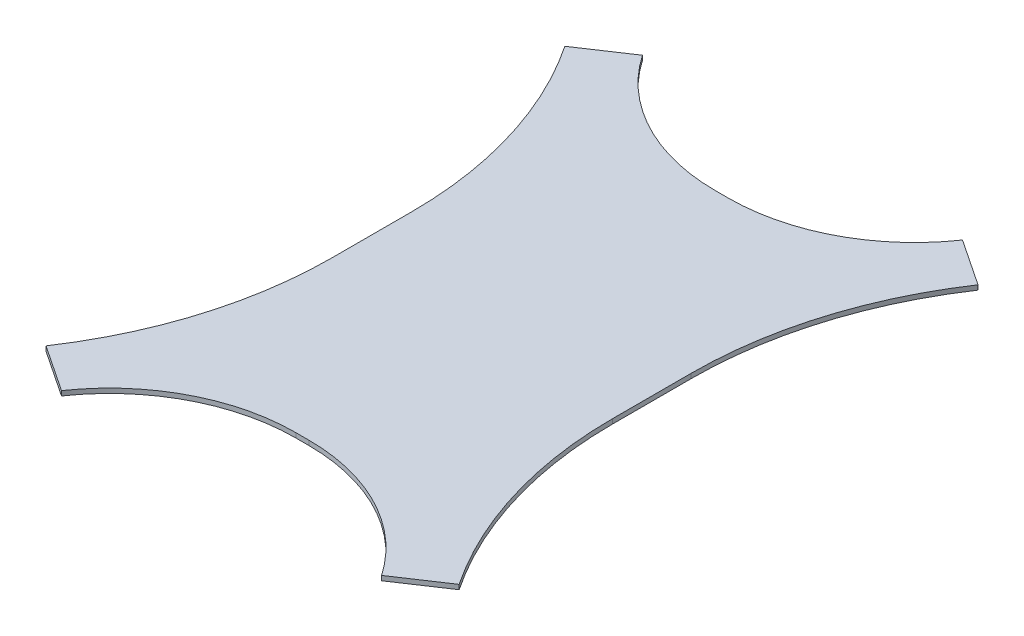
ISO-10303-21;
HEADER;
FILE_DESCRIPTION(('STEP AP214'),'2;1');
FILE_NAME('part.step','',(''),(''),'','','');
FILE_SCHEMA(('AUTOMOTIVE_DESIGN { 1 0 10303 214 1 1 1 1 }'));
ENDSEC;
DATA;
#1=APPLICATION_CONTEXT('core data for automotive mechanical design processes');
#2=APPLICATION_PROTOCOL_DEFINITION('international standard','automotive_design',2000,#1);
#3=PRODUCT_CONTEXT('',#1,'mechanical');
#4=PRODUCT('Part','Part','',(#3));
#5=PRODUCT_RELATED_PRODUCT_CATEGORY('part','',(#4));
#6=PRODUCT_DEFINITION_FORMATION('','',#4);
#7=PRODUCT_DEFINITION_CONTEXT('part definition',#1,'design');
#8=PRODUCT_DEFINITION('design','',#6,#7);
#9=PRODUCT_DEFINITION_SHAPE('','',#8);
#10=(LENGTH_UNIT() NAMED_UNIT(*) SI_UNIT(.MILLI.,.METRE.));
#11=(NAMED_UNIT(*) PLANE_ANGLE_UNIT() SI_UNIT($,.RADIAN.));
#12=(NAMED_UNIT(*) SI_UNIT($,.STERADIAN.) SOLID_ANGLE_UNIT());
#13=UNCERTAINTY_MEASURE_WITH_UNIT(LENGTH_MEASURE(1.E-05),#10,'distance_accuracy_value','');
#14=(GEOMETRIC_REPRESENTATION_CONTEXT(3) GLOBAL_UNCERTAINTY_ASSIGNED_CONTEXT((#13)) GLOBAL_UNIT_ASSIGNED_CONTEXT((#10,
#11,#12)) REPRESENTATION_CONTEXT('',''));
#15=CARTESIAN_POINT('',(0.,0.,0.));
#16=DIRECTION('',(0.,0.,1.));
#17=DIRECTION('',(1.,0.,0.));
#18=AXIS2_PLACEMENT_3D('',#15,#16,#17);
#19=CARTESIAN_POINT('',(60.,1.,-90.));
#20=DIRECTION('',(-1.,0.,0.));
#21=DIRECTION('',(0.,0.,1.));
#22=AXIS2_PLACEMENT_3D('',#19,#20,#21);
#23=PLANE('',#22);
#24=DIRECTION('',(0.,0.,-1.));
#25=VECTOR('',#24,1.);
#26=CARTESIAN_POINT('',(60.,-1.,-90.));
#27=LINE('',#26,#25);
#28=CARTESIAN_POINT('',(60.,-1.,16.894833932777));
#29=VERTEX_POINT('',#28);
#30=CARTESIAN_POINT('',(60.,-1.,-16.894833932777));
#31=VERTEX_POINT('',#30);
#32=EDGE_CURVE('E233',#29,#31,#27,.T.);
#33=ORIENTED_EDGE('',*,*,#32,.T.);
#34=DIRECTION('',(0.,-1.,0.));
#35=VECTOR('',#34,1.);
#36=CARTESIAN_POINT('',(60.,1.,-16.894833932777));
#37=LINE('',#36,#35);
#38=CARTESIAN_POINT('',(60.,1.,-16.894833932777));
#39=VERTEX_POINT('',#38);
#40=EDGE_CURVE('E311',#31,#39,#37,.F.);
#41=ORIENTED_EDGE('',*,*,#40,.T.);
#42=DIRECTION('',(0.,0.,-1.));
#43=VECTOR('',#42,1.);
#44=CARTESIAN_POINT('',(60.,1.,-90.));
#45=LINE('',#44,#43);
#46=CARTESIAN_POINT('',(60.,1.,16.894833932777));
#47=VERTEX_POINT('',#46);
#48=EDGE_CURVE('E238',#47,#39,#45,.T.);
#49=ORIENTED_EDGE('',*,*,#48,.F.);
#50=DIRECTION('',(0.,-1.,0.));
#51=VECTOR('',#50,1.);
#52=CARTESIAN_POINT('',(60.,-1.,16.8948339327771));
#53=LINE('',#52,#51);
#54=EDGE_CURVE('E308',#47,#29,#53,.T.);
#55=ORIENTED_EDGE('',*,*,#54,.T.);
#56=EDGE_LOOP('',(#33,#41,#49,#55));
#57=FACE_BOUND('',#56,.T.);
#58=ADVANCED_FACE('F33',(#57),#23,.F.);
#59=CARTESIAN_POINT('',(-60.,1.,90.));
#60=DIRECTION('',(0.,0.,-1.));
#61=DIRECTION('',(-1.,0.,0.));
#62=AXIS2_PLACEMENT_3D('',#59,#60,#61);
#63=PLANE('',#62);
#64=DIRECTION('',(1.,0.,0.));
#65=VECTOR('',#64,1.);
#66=CARTESIAN_POINT('',(-60.,1.,90.));
#67=LINE('',#66,#65);
#68=CARTESIAN_POINT('',(-2.77308622038017,1.,90.));
#69=VERTEX_POINT('',#68);
#70=CARTESIAN_POINT('',(2.77308622038017,1.,90.));
#71=VERTEX_POINT('',#70);
#72=EDGE_CURVE('E248',#69,#71,#67,.T.);
#73=ORIENTED_EDGE('',*,*,#72,.F.);
#74=DIRECTION('',(0.,-1.,0.));
#75=VECTOR('',#74,1.);
#76=CARTESIAN_POINT('',(-2.77308622038017,1.,90.));
#77=LINE('',#76,#75);
#78=CARTESIAN_POINT('',(-2.77308622038017,-1.,90.));
#79=VERTEX_POINT('',#78);
#80=EDGE_CURVE('E277',#69,#79,#77,.T.);
#81=ORIENTED_EDGE('',*,*,#80,.T.);
#82=DIRECTION('',(1.,0.,0.));
#83=VECTOR('',#82,1.);
#84=CARTESIAN_POINT('',(-60.,-1.,90.));
#85=LINE('',#84,#83);
#86=CARTESIAN_POINT('',(2.77308622038017,-1.,90.));
#87=VERTEX_POINT('',#86);
#88=EDGE_CURVE('E242',#79,#87,#85,.T.);
#89=ORIENTED_EDGE('',*,*,#88,.T.);
#90=DIRECTION('',(0.,-1.,0.));
#91=VECTOR('',#90,1.);
#92=CARTESIAN_POINT('',(2.77308622038017,1.,90.));
#93=LINE('',#92,#91);
#94=EDGE_CURVE('E274',#87,#71,#93,.F.);
#95=ORIENTED_EDGE('',*,*,#94,.T.);
#96=EDGE_LOOP('',(#73,#81,#89,#95));
#97=FACE_BOUND('',#96,.T.);
#98=ADVANCED_FACE('F343',(#97),#63,.F.);
#99=CARTESIAN_POINT('',(-60.,1.,-90.));
#100=DIRECTION('',(0.,0.,1.));
#101=DIRECTION('',(1.,0.,0.));
#102=AXIS2_PLACEMENT_3D('',#99,#100,#101);
#103=PLANE('',#102);
#104=DIRECTION('',(-1.,0.,0.));
#105=VECTOR('',#104,1.);
#106=CARTESIAN_POINT('',(-60.,1.,-90.));
#107=LINE('',#106,#105);
#108=CARTESIAN_POINT('',(2.77308622038024,1.,-90.));
#109=VERTEX_POINT('',#108);
#110=CARTESIAN_POINT('',(-2.77308622038024,1.,-90.));
#111=VERTEX_POINT('',#110);
#112=EDGE_CURVE('E241',#109,#111,#107,.T.);
#113=ORIENTED_EDGE('',*,*,#112,.F.);
#114=DIRECTION('',(0.,-1.,0.));
#115=VECTOR('',#114,1.);
#116=CARTESIAN_POINT('',(2.77308622038024,1.,-90.));
#117=LINE('',#116,#115);
#118=CARTESIAN_POINT('',(2.77308622038024,-1.,-90.));
#119=VERTEX_POINT('',#118);
#120=EDGE_CURVE('E264',#109,#119,#117,.T.);
#121=ORIENTED_EDGE('',*,*,#120,.T.);
#122=DIRECTION('',(-1.,0.,0.));
#123=VECTOR('',#122,1.);
#124=CARTESIAN_POINT('',(-60.,-1.,-90.));
#125=LINE('',#124,#123);
#126=CARTESIAN_POINT('',(-2.77308622038024,-1.,-90.));
#127=VERTEX_POINT('',#126);
#128=EDGE_CURVE('E254',#119,#127,#125,.T.);
#129=ORIENTED_EDGE('',*,*,#128,.T.);
#130=DIRECTION('',(0.,-1.,0.));
#131=VECTOR('',#130,1.);
#132=CARTESIAN_POINT('',(-2.77308622038024,1.,-90.));
#133=LINE('',#132,#131);
#134=EDGE_CURVE('E251',#127,#111,#133,.F.);
#135=ORIENTED_EDGE('',*,*,#134,.T.);
#136=EDGE_LOOP('',(#113,#121,#129,#135));
#137=FACE_BOUND('',#136,.T.);
#138=ADVANCED_FACE('F388',(#137),#103,.F.);
#139=CARTESIAN_POINT('',(-60.,1.,-90.));
#140=DIRECTION('',(1.,0.,0.));
#141=DIRECTION('',(0.,0.,-1.));
#142=AXIS2_PLACEMENT_3D('',#139,#140,#141);
#143=PLANE('',#142);
#144=DIRECTION('',(0.,0.,1.));
#145=VECTOR('',#144,1.);
#146=CARTESIAN_POINT('',(-60.,-1.,-90.));
#147=LINE('',#146,#145);
#148=CARTESIAN_POINT('',(-60.,-1.,-16.8948339327771));
#149=VERTEX_POINT('',#148);
#150=CARTESIAN_POINT('',(-60.,-1.,16.894833932777));
#151=VERTEX_POINT('',#150);
#152=EDGE_CURVE('E257',#149,#151,#147,.T.);
#153=ORIENTED_EDGE('',*,*,#152,.T.);
#154=DIRECTION('',(0.,-1.,0.));
#155=VECTOR('',#154,1.);
#156=CARTESIAN_POINT('',(-60.,1.,16.8948339327771));
#157=LINE('',#156,#155);
#158=CARTESIAN_POINT('',(-60.,1.,16.894833932777));
#159=VERTEX_POINT('',#158);
#160=EDGE_CURVE('E293',#151,#159,#157,.F.);
#161=ORIENTED_EDGE('',*,*,#160,.T.);
#162=DIRECTION('',(0.,0.,1.));
#163=VECTOR('',#162,1.);
#164=CARTESIAN_POINT('',(-60.,1.,-90.));
#165=LINE('',#164,#163);
#166=CARTESIAN_POINT('',(-60.,1.,-16.8948339327771));
#167=VERTEX_POINT('',#166);
#168=EDGE_CURVE('E245',#167,#159,#165,.T.);
#169=ORIENTED_EDGE('',*,*,#168,.F.);
#170=DIRECTION('',(0.,-1.,0.));
#171=VECTOR('',#170,1.);
#172=CARTESIAN_POINT('',(-60.,-1.,-16.8948339327771));
#173=LINE('',#172,#171);
#174=EDGE_CURVE('E290',#167,#149,#173,.T.);
#175=ORIENTED_EDGE('',*,*,#174,.T.);
#176=EDGE_LOOP('',(#153,#161,#169,#175));
#177=FACE_BOUND('',#176,.T.);
#178=ADVANCED_FACE('F362',(#177),#143,.F.);
#179=CARTESIAN_POINT('',(0.,1.,0.));
#180=DIRECTION('',(0.,1.,0.));
#181=DIRECTION('',(0.,0.,1.));
#182=AXIS2_PLACEMENT_3D('',#179,#180,#181);
#183=PLANE('',#182);
#184=DIRECTION('',(0.554700196225229,0.,0.832050294337844));
#185=VECTOR('',#184,1.);
#186=CARTESIAN_POINT('',(-68.6915549246456,1.,-124.670640039752));
#187=LINE('',#186,#185);
#188=CARTESIAN_POINT('',(88.5514499625666,1.,111.193867291066));
#189=VERTEX_POINT('',#188);
#190=CARTESIAN_POINT('',(88.6596525883614,1.,111.356171229758));
#191=VERTEX_POINT('',#190);
#192=EDGE_CURVE('E172',#189,#191,#187,.T.);
#193=ORIENTED_EDGE('',*,*,#192,.F.);
#194=CARTESIAN_POINT('',(230.,1.,16.894833932777));
#195=DIRECTION('',(0.,1.,0.));
#196=DIRECTION('',(0.,0.,1.));
#197=AXIS2_PLACEMENT_3D('',#194,#195,#196);
#198=CIRCLE('',#197,170.);
#199=EDGE_CURVE('E11',#189,#47,#198,.F.);
#200=ORIENTED_EDGE('',*,*,#199,.T.);
#201=ORIENTED_EDGE('',*,*,#48,.T.);
#202=CARTESIAN_POINT('',(230.,1.,-16.894833932777));
#203=DIRECTION('',(0.,1.,0.));
#204=DIRECTION('',(0.,0.,1.));
#205=AXIS2_PLACEMENT_3D('',#202,#203,#204);
#206=CIRCLE('',#205,170.);
#207=CARTESIAN_POINT('',(88.5514499625666,1.,-111.193867291066));
#208=VERTEX_POINT('',#207);
#209=EDGE_CURVE('E316',#39,#208,#206,.F.);
#210=ORIENTED_EDGE('',*,*,#209,.T.);
#211=DIRECTION('',(0.554700196225229,0.,-0.832050294337844));
#212=VECTOR('',#211,1.);
#213=CARTESIAN_POINT('',(-50.0165058683383,1.,96.6580664552914));
#214=LINE('',#213,#212);
#215=CARTESIAN_POINT('',(88.6596525883614,1.,-111.356171229758));
#216=VERTEX_POINT('',#215);
#217=EDGE_CURVE('E229',#208,#216,#214,.T.);
#218=ORIENTED_EDGE('',*,*,#217,.T.);
#219=DIRECTION('',(0.832050294337844,0.,0.554700196225229));
#220=VECTOR('',#219,1.);
#221=CARTESIAN_POINT('',(88.6596525883614,1.,-111.356171229758));
#222=LINE('',#221,#220);
#223=CARTESIAN_POINT('',(68.6904455242531,1.,-124.668975939164));
#224=VERTEX_POINT('',#223);
#225=EDGE_CURVE('E226',#224,#216,#222,.T.);
#226=ORIENTED_EDGE('',*,*,#225,.F.);
#227=CARTESIAN_POINT('',(2.77308622038024,1.,-170.));
#228=DIRECTION('',(0.,1.,0.));
#229=DIRECTION('',(0.,0.,1.));
#230=AXIS2_PLACEMENT_3D('',#227,#228,#229);
#231=CIRCLE('',#230,80.);
#232=EDGE_CURVE('E266',#224,#109,#231,.F.);
#233=ORIENTED_EDGE('',*,*,#232,.T.);
#234=ORIENTED_EDGE('',*,*,#112,.T.);
#235=CARTESIAN_POINT('',(-2.77308622038024,1.,-170.));
#236=DIRECTION('',(0.,1.,0.));
#237=DIRECTION('',(0.,0.,1.));
#238=AXIS2_PLACEMENT_3D('',#235,#236,#237);
#239=CIRCLE('',#238,80.);
#240=CARTESIAN_POINT('',(-68.6904455242531,1.,-124.668975939164));
#241=VERTEX_POINT('',#240);
#242=EDGE_CURVE('E270',#111,#241,#239,.F.);
#243=ORIENTED_EDGE('',*,*,#242,.T.);
#244=DIRECTION('',(-0.832050294337844,0.,0.554700196225229));
#245=VECTOR('',#244,1.);
#246=CARTESIAN_POINT('',(-88.6596525883614,1.,-111.356171229758));
#247=LINE('',#246,#245);
#248=CARTESIAN_POINT('',(-88.6596525883614,1.,-111.356171229758));
#249=VERTEX_POINT('',#248);
#250=EDGE_CURVE('E211',#241,#249,#247,.T.);
#251=ORIENTED_EDGE('',*,*,#250,.T.);
#252=DIRECTION('',(-0.554700196225229,0.,-0.832050294337844));
#253=VECTOR('',#252,1.);
#254=CARTESIAN_POINT('',(50.0165058683383,1.,96.6580664552914));
#255=LINE('',#254,#253);
#256=CARTESIAN_POINT('',(-88.5514499625666,1.,-111.193867291066));
#257=VERTEX_POINT('',#256);
#258=EDGE_CURVE('E203',#257,#249,#255,.T.);
#259=ORIENTED_EDGE('',*,*,#258,.F.);
#260=CARTESIAN_POINT('',(-230.,1.,-16.894833932777));
#261=DIRECTION('',(0.,1.,0.));
#262=DIRECTION('',(0.,0.,1.));
#263=AXIS2_PLACEMENT_3D('',#260,#261,#262);
#264=CIRCLE('',#263,170.);
#265=EDGE_CURVE('E303',#257,#167,#264,.F.);
#266=ORIENTED_EDGE('',*,*,#265,.T.);
#267=ORIENTED_EDGE('',*,*,#168,.T.);
#268=CARTESIAN_POINT('',(-230.,1.,16.8948339327771));
#269=DIRECTION('',(0.,1.,0.));
#270=DIRECTION('',(0.,0.,1.));
#271=AXIS2_PLACEMENT_3D('',#268,#269,#270);
#272=CIRCLE('',#271,170.);
#273=CARTESIAN_POINT('',(-88.5514499625666,1.,111.193867291066));
#274=VERTEX_POINT('',#273);
#275=EDGE_CURVE('E299',#159,#274,#272,.F.);
#276=ORIENTED_EDGE('',*,*,#275,.T.);
#277=DIRECTION('',(-0.554700196225229,0.,0.832050294337844));
#278=VECTOR('',#277,1.);
#279=CARTESIAN_POINT('',(68.6915549246456,1.,-124.670640039752));
#280=LINE('',#279,#278);
#281=CARTESIAN_POINT('',(-88.6596525883614,1.,111.356171229758));
#282=VERTEX_POINT('',#281);
#283=EDGE_CURVE('E187',#274,#282,#280,.T.);
#284=ORIENTED_EDGE('',*,*,#283,.T.);
#285=DIRECTION('',(-0.832050294337844,0.,-0.554700196225229));
#286=VECTOR('',#285,1.);
#287=CARTESIAN_POINT('',(-88.6596525883614,1.,111.356171229758));
#288=LINE('',#287,#286);
#289=CARTESIAN_POINT('',(-68.6904455242531,1.,124.668975939164));
#290=VERTEX_POINT('',#289);
#291=EDGE_CURVE('E197',#290,#282,#288,.T.);
#292=ORIENTED_EDGE('',*,*,#291,.F.);
#293=CARTESIAN_POINT('',(-2.77308622038017,1.,170.));
#294=DIRECTION('',(0.,1.,0.));
#295=DIRECTION('',(0.,0.,1.));
#296=AXIS2_PLACEMENT_3D('',#293,#294,#295);
#297=CIRCLE('',#296,80.);
#298=EDGE_CURVE('E279',#290,#69,#297,.F.);
#299=ORIENTED_EDGE('',*,*,#298,.T.);
#300=ORIENTED_EDGE('',*,*,#72,.T.);
#301=CARTESIAN_POINT('',(2.77308622038017,1.,170.));
#302=DIRECTION('',(0.,1.,0.));
#303=DIRECTION('',(0.,0.,1.));
#304=AXIS2_PLACEMENT_3D('',#301,#302,#303);
#305=CIRCLE('',#304,80.);
#306=CARTESIAN_POINT('',(68.6904455242531,1.,124.668975939164));
#307=VERTEX_POINT('',#306);
#308=EDGE_CURVE('E283',#71,#307,#305,.F.);
#309=ORIENTED_EDGE('',*,*,#308,.T.);
#310=DIRECTION('',(0.832050294337844,0.,-0.554700196225229));
#311=VECTOR('',#310,1.);
#312=CARTESIAN_POINT('',(88.6596525883614,1.,111.356171229758));
#313=LINE('',#312,#311);
#314=EDGE_CURVE('E171',#307,#191,#313,.T.);
#315=ORIENTED_EDGE('',*,*,#314,.T.);
#316=EDGE_LOOP('',(#193,#200,#201,#210,#218,#226,#233,#234,#243,#251,#259,#266,#267,#276,#284,
#292,#299,#300,#309,#315));
#317=FACE_BOUND('',#316,.T.);
#318=ADVANCED_FACE('F320',(#317),#183,.T.);
#319=CARTESIAN_POINT('',(0.,-1.,0.));
#320=DIRECTION('',(0.,1.,0.));
#321=DIRECTION('',(0.,0.,1.));
#322=AXIS2_PLACEMENT_3D('',#319,#320,#321);
#323=PLANE('',#322);
#324=ORIENTED_EDGE('',*,*,#32,.F.);
#325=CARTESIAN_POINT('',(230.,-1.,16.894833932777));
#326=DIRECTION('',(0.,1.,0.));
#327=DIRECTION('',(0.,0.,1.));
#328=AXIS2_PLACEMENT_3D('',#325,#326,#327);
#329=CIRCLE('',#328,170.);
#330=CARTESIAN_POINT('',(88.5514499625666,-1.,111.193867291066));
#331=VERTEX_POINT('',#330);
#332=EDGE_CURVE('E41',#29,#331,#329,.T.);
#333=ORIENTED_EDGE('',*,*,#332,.T.);
#334=DIRECTION('',(0.554700196225229,0.,0.832050294337844));
#335=VECTOR('',#334,1.);
#336=CARTESIAN_POINT('',(-68.6915549246456,-1.,-124.670640039752));
#337=LINE('',#336,#335);
#338=CARTESIAN_POINT('',(88.6596525883614,-1.,111.356171229758));
#339=VERTEX_POINT('',#338);
#340=EDGE_CURVE('E165',#331,#339,#337,.T.);
#341=ORIENTED_EDGE('',*,*,#340,.T.);
#342=DIRECTION('',(-0.832050294337844,0.,0.554700196225229));
#343=VECTOR('',#342,1.);
#344=CARTESIAN_POINT('',(88.6596525883614,-1.,111.356171229758));
#345=LINE('',#344,#343);
#346=CARTESIAN_POINT('',(68.6904455242531,-1.,124.668975939164));
#347=VERTEX_POINT('',#346);
#348=EDGE_CURVE('E168',#339,#347,#345,.T.);
#349=ORIENTED_EDGE('',*,*,#348,.T.);
#350=CARTESIAN_POINT('',(2.77308622038017,-1.,170.));
#351=DIRECTION('',(0.,1.,0.));
#352=DIRECTION('',(0.,0.,1.));
#353=AXIS2_PLACEMENT_3D('',#350,#351,#352);
#354=CIRCLE('',#353,80.);
#355=EDGE_CURVE('E285',#347,#87,#354,.T.);
#356=ORIENTED_EDGE('',*,*,#355,.T.);
#357=ORIENTED_EDGE('',*,*,#88,.F.);
#358=CARTESIAN_POINT('',(-2.77308622038017,-1.,170.));
#359=DIRECTION('',(0.,1.,0.));
#360=DIRECTION('',(0.,0.,1.));
#361=AXIS2_PLACEMENT_3D('',#358,#359,#360);
#362=CIRCLE('',#361,80.);
#363=CARTESIAN_POINT('',(-68.6904455242531,-1.,124.668975939164));
#364=VERTEX_POINT('',#363);
#365=EDGE_CURVE('E281',#79,#364,#362,.T.);
#366=ORIENTED_EDGE('',*,*,#365,.T.);
#367=DIRECTION('',(0.832050294337844,0.,0.554700196225229));
#368=VECTOR('',#367,1.);
#369=CARTESIAN_POINT('',(-88.6596525883614,-1.,111.356171229758));
#370=LINE('',#369,#368);
#371=CARTESIAN_POINT('',(-88.6596525883614,-1.,111.356171229758));
#372=VERTEX_POINT('',#371);
#373=EDGE_CURVE('E196',#372,#364,#370,.T.);
#374=ORIENTED_EDGE('',*,*,#373,.F.);
#375=DIRECTION('',(-0.554700196225229,0.,0.832050294337844));
#376=VECTOR('',#375,1.);
#377=CARTESIAN_POINT('',(68.6915549246456,-1.,-124.670640039752));
#378=LINE('',#377,#376);
#379=CARTESIAN_POINT('',(-88.5514499625666,-1.,111.193867291066));
#380=VERTEX_POINT('',#379);
#381=EDGE_CURVE('E185',#380,#372,#378,.T.);
#382=ORIENTED_EDGE('',*,*,#381,.F.);
#383=CARTESIAN_POINT('',(-230.,-1.,16.8948339327771));
#384=DIRECTION('',(0.,1.,0.));
#385=DIRECTION('',(0.,0.,1.));
#386=AXIS2_PLACEMENT_3D('',#383,#384,#385);
#387=CIRCLE('',#386,170.);
#388=EDGE_CURVE('E297',#380,#151,#387,.T.);
#389=ORIENTED_EDGE('',*,*,#388,.T.);
#390=ORIENTED_EDGE('',*,*,#152,.F.);
#391=CARTESIAN_POINT('',(-230.,-1.,-16.894833932777));
#392=DIRECTION('',(0.,1.,0.));
#393=DIRECTION('',(0.,0.,1.));
#394=AXIS2_PLACEMENT_3D('',#391,#392,#393);
#395=CIRCLE('',#394,170.);
#396=CARTESIAN_POINT('',(-88.5514499625666,-1.,-111.193867291066));
#397=VERTEX_POINT('',#396);
#398=EDGE_CURVE('E301',#149,#397,#395,.T.);
#399=ORIENTED_EDGE('',*,*,#398,.T.);
#400=DIRECTION('',(-0.554700196225229,0.,-0.832050294337844));
#401=VECTOR('',#400,1.);
#402=CARTESIAN_POINT('',(50.0165058683383,-1.,96.6580664552914));
#403=LINE('',#402,#401);
#404=CARTESIAN_POINT('',(-88.6596525883614,-1.,-111.356171229758));
#405=VERTEX_POINT('',#404);
#406=EDGE_CURVE('E214',#397,#405,#403,.T.);
#407=ORIENTED_EDGE('',*,*,#406,.T.);
#408=DIRECTION('',(0.832050294337844,0.,-0.554700196225229));
#409=VECTOR('',#408,1.);
#410=CARTESIAN_POINT('',(-88.6596525883614,-1.,-111.356171229758));
#411=LINE('',#410,#409);
#412=CARTESIAN_POINT('',(-68.6904455242531,-1.,-124.668975939164));
#413=VERTEX_POINT('',#412);
#414=EDGE_CURVE('E210',#405,#413,#411,.T.);
#415=ORIENTED_EDGE('',*,*,#414,.T.);
#416=CARTESIAN_POINT('',(-2.77308622038024,-1.,-170.));
#417=DIRECTION('',(0.,1.,0.));
#418=DIRECTION('',(0.,0.,1.));
#419=AXIS2_PLACEMENT_3D('',#416,#417,#418);
#420=CIRCLE('',#419,80.);
#421=EDGE_CURVE('E272',#413,#127,#420,.T.);
#422=ORIENTED_EDGE('',*,*,#421,.T.);
#423=ORIENTED_EDGE('',*,*,#128,.F.);
#424=CARTESIAN_POINT('',(2.77308622038024,-1.,-170.));
#425=DIRECTION('',(0.,1.,0.));
#426=DIRECTION('',(0.,0.,1.));
#427=AXIS2_PLACEMENT_3D('',#424,#425,#426);
#428=CIRCLE('',#427,80.);
#429=CARTESIAN_POINT('',(68.6904455242531,-1.,-124.668975939164));
#430=VERTEX_POINT('',#429);
#431=EDGE_CURVE('E268',#119,#430,#428,.T.);
#432=ORIENTED_EDGE('',*,*,#431,.T.);
#433=DIRECTION('',(-0.832050294337844,0.,-0.554700196225229));
#434=VECTOR('',#433,1.);
#435=CARTESIAN_POINT('',(88.6596525883614,-1.,-111.356171229758));
#436=LINE('',#435,#434);
#437=CARTESIAN_POINT('',(88.6596525883614,-1.,-111.356171229758));
#438=VERTEX_POINT('',#437);
#439=EDGE_CURVE('E225',#438,#430,#436,.T.);
#440=ORIENTED_EDGE('',*,*,#439,.F.);
#441=DIRECTION('',(0.554700196225229,0.,-0.832050294337844));
#442=VECTOR('',#441,1.);
#443=CARTESIAN_POINT('',(-50.0165058683383,-1.,96.6580664552914));
#444=LINE('',#443,#442);
#445=CARTESIAN_POINT('',(88.5514499625666,-1.,-111.193867291066));
#446=VERTEX_POINT('',#445);
#447=EDGE_CURVE('E218',#446,#438,#444,.T.);
#448=ORIENTED_EDGE('',*,*,#447,.F.);
#449=CARTESIAN_POINT('',(230.,-1.,-16.894833932777));
#450=DIRECTION('',(0.,1.,0.));
#451=DIRECTION('',(0.,0.,1.));
#452=AXIS2_PLACEMENT_3D('',#449,#450,#451);
#453=CIRCLE('',#452,170.);
#454=EDGE_CURVE('E314',#446,#31,#453,.T.);
#455=ORIENTED_EDGE('',*,*,#454,.T.);
#456=EDGE_LOOP('',(#324,#333,#341,#349,#356,#357,#366,#374,#382,#389,#390,#399,#407,#415,#422,
#423,#432,#440,#448,#455));
#457=FACE_BOUND('',#456,.T.);
#458=ADVANCED_FACE('F167',(#457),#323,.F.);
#459=CARTESIAN_POINT('',(78.6750490563072,0.,-118.012573584461));
#460=DIRECTION('',(0.554700196225229,0.,-0.832050294337844));
#461=DIRECTION('',(-0.832050294337844,0.,-0.554700196225229));
#462=AXIS2_PLACEMENT_3D('',#459,#460,#461);
#463=PLANE('',#462);
#464=DIRECTION('',(0.,-1.,0.));
#465=VECTOR('',#464,1.);
#466=CARTESIAN_POINT('',(88.6596525883614,1.,-111.356171229758));
#467=LINE('',#466,#465);
#468=EDGE_CURVE('E230',#216,#438,#467,.T.);
#469=ORIENTED_EDGE('',*,*,#468,.T.);
#470=ORIENTED_EDGE('',*,*,#439,.T.);
#471=DIRECTION('',(0.,1.,0.));
#472=VECTOR('',#471,1.);
#473=CARTESIAN_POINT('',(68.6904455242531,1.,-124.668975939164));
#474=LINE('',#473,#472);
#475=EDGE_CURVE('E222',#430,#224,#474,.T.);
#476=ORIENTED_EDGE('',*,*,#475,.T.);
#477=ORIENTED_EDGE('',*,*,#225,.T.);
#478=EDGE_LOOP('',(#469,#470,#476,#477));
#479=FACE_BOUND('',#478,.T.);
#480=ADVANCED_FACE('F395',(#479),#463,.T.);
#481=CARTESIAN_POINT('',(-50.0165058683383,1.,96.6580664552914));
#482=DIRECTION('',(0.832050294337844,0.,0.554700196225229));
#483=DIRECTION('',(0.554700196225229,0.,-0.832050294337844));
#484=AXIS2_PLACEMENT_3D('',#481,#482,#483);
#485=PLANE('',#484);
#486=ORIENTED_EDGE('',*,*,#217,.F.);
#487=DIRECTION('',(0.,-1.,0.));
#488=VECTOR('',#487,1.);
#489=CARTESIAN_POINT('',(88.5514499625666,1.,-111.193867291066));
#490=LINE('',#489,#488);
#491=EDGE_CURVE('E305',#208,#446,#490,.T.);
#492=ORIENTED_EDGE('',*,*,#491,.T.);
#493=ORIENTED_EDGE('',*,*,#447,.T.);
#494=ORIENTED_EDGE('',*,*,#468,.F.);
#495=EDGE_LOOP('',(#486,#492,#493,#494));
#496=FACE_BOUND('',#495,.T.);
#497=ADVANCED_FACE('F328',(#496),#485,.T.);
#498=CARTESIAN_POINT('',(-78.6750490563072,0.,-118.012573584461));
#499=DIRECTION('',(-0.554700196225229,0.,-0.832050294337844));
#500=DIRECTION('',(0.832050294337844,0.,-0.554700196225229));
#501=AXIS2_PLACEMENT_3D('',#498,#499,#500);
#502=PLANE('',#501);
#503=DIRECTION('',(0.,-1.,0.));
#504=VECTOR('',#503,1.);
#505=CARTESIAN_POINT('',(-88.6596525883614,1.,-111.356171229758));
#506=LINE('',#505,#504);
#507=EDGE_CURVE('E215',#249,#405,#506,.T.);
#508=ORIENTED_EDGE('',*,*,#507,.F.);
#509=ORIENTED_EDGE('',*,*,#250,.F.);
#510=DIRECTION('',(0.,1.,0.));
#511=VECTOR('',#510,1.);
#512=CARTESIAN_POINT('',(-68.6904455242531,1.,-124.668975939164));
#513=LINE('',#512,#511);
#514=EDGE_CURVE('E207',#413,#241,#513,.T.);
#515=ORIENTED_EDGE('',*,*,#514,.F.);
#516=ORIENTED_EDGE('',*,*,#414,.F.);
#517=EDGE_LOOP('',(#508,#509,#515,#516));
#518=FACE_BOUND('',#517,.T.);
#519=ADVANCED_FACE('F379',(#518),#502,.T.);
#520=CARTESIAN_POINT('',(50.0165058683383,1.,96.6580664552914));
#521=DIRECTION('',(0.832050294337844,0.,-0.554700196225229));
#522=DIRECTION('',(-0.554700196225229,0.,-0.832050294337844));
#523=AXIS2_PLACEMENT_3D('',#520,#521,#522);
#524=PLANE('',#523);
#525=ORIENTED_EDGE('',*,*,#406,.F.);
#526=DIRECTION('',(0.,-1.,0.));
#527=VECTOR('',#526,1.);
#528=CARTESIAN_POINT('',(-88.5514499625666,1.,-111.193867291066));
#529=LINE('',#528,#527);
#530=EDGE_CURVE('E295',#397,#257,#529,.F.);
#531=ORIENTED_EDGE('',*,*,#530,.T.);
#532=ORIENTED_EDGE('',*,*,#258,.T.);
#533=ORIENTED_EDGE('',*,*,#507,.T.);
#534=EDGE_LOOP('',(#525,#531,#532,#533));
#535=FACE_BOUND('',#534,.T.);
#536=ADVANCED_FACE('F375',(#535),#524,.F.);
#537=CARTESIAN_POINT('',(-78.6750490563072,0.,118.012573584461));
#538=DIRECTION('',(-0.554700196225229,0.,0.832050294337844));
#539=DIRECTION('',(0.832050294337844,0.,0.554700196225229));
#540=AXIS2_PLACEMENT_3D('',#537,#538,#539);
#541=PLANE('',#540);
#542=DIRECTION('',(0.,-1.,0.));
#543=VECTOR('',#542,1.);
#544=CARTESIAN_POINT('',(-88.6596525883614,1.,111.356171229758));
#545=LINE('',#544,#543);
#546=EDGE_CURVE('E200',#282,#372,#545,.T.);
#547=ORIENTED_EDGE('',*,*,#546,.T.);
#548=ORIENTED_EDGE('',*,*,#373,.T.);
#549=DIRECTION('',(0.,1.,0.));
#550=VECTOR('',#549,1.);
#551=CARTESIAN_POINT('',(-68.6904455242531,1.,124.668975939164));
#552=LINE('',#551,#550);
#553=EDGE_CURVE('E193',#364,#290,#552,.T.);
#554=ORIENTED_EDGE('',*,*,#553,.T.);
#555=ORIENTED_EDGE('',*,*,#291,.T.);
#556=EDGE_LOOP('',(#547,#548,#554,#555));
#557=FACE_BOUND('',#556,.T.);
#558=ADVANCED_FACE('F352',(#557),#541,.T.);
#559=CARTESIAN_POINT('',(68.6915549246456,1.,-124.670640039752));
#560=DIRECTION('',(-0.832050294337844,0.,-0.554700196225229));
#561=DIRECTION('',(-0.554700196225229,0.,0.832050294337844));
#562=AXIS2_PLACEMENT_3D('',#559,#560,#561);
#563=PLANE('',#562);
#564=ORIENTED_EDGE('',*,*,#283,.F.);
#565=DIRECTION('',(0.,-1.,0.));
#566=VECTOR('',#565,1.);
#567=CARTESIAN_POINT('',(-88.5514499625666,1.,111.193867291066));
#568=LINE('',#567,#566);
#569=EDGE_CURVE('E287',#274,#380,#568,.T.);
#570=ORIENTED_EDGE('',*,*,#569,.T.);
#571=ORIENTED_EDGE('',*,*,#381,.T.);
#572=ORIENTED_EDGE('',*,*,#546,.F.);
#573=EDGE_LOOP('',(#564,#570,#571,#572));
#574=FACE_BOUND('',#573,.T.);
#575=ADVANCED_FACE('F356',(#574),#563,.T.);
#576=CARTESIAN_POINT('',(78.6750490563072,0.,118.012573584461));
#577=DIRECTION('',(0.554700196225229,0.,0.832050294337844));
#578=DIRECTION('',(-0.832050294337844,0.,0.554700196225229));
#579=AXIS2_PLACEMENT_3D('',#576,#577,#578);
#580=PLANE('',#579);
#581=DIRECTION('',(0.,-1.,0.));
#582=VECTOR('',#581,1.);
#583=CARTESIAN_POINT('',(88.6596525883614,1.,111.356171229758));
#584=LINE('',#583,#582);
#585=EDGE_CURVE('E178',#191,#339,#584,.T.);
#586=ORIENTED_EDGE('',*,*,#585,.F.);
#587=ORIENTED_EDGE('',*,*,#314,.F.);
#588=DIRECTION('',(0.,1.,0.));
#589=VECTOR('',#588,1.);
#590=CARTESIAN_POINT('',(68.6904455242531,1.,124.668975939164));
#591=LINE('',#590,#589);
#592=EDGE_CURVE('E180',#347,#307,#591,.T.);
#593=ORIENTED_EDGE('',*,*,#592,.F.);
#594=ORIENTED_EDGE('',*,*,#348,.F.);
#595=EDGE_LOOP('',(#586,#587,#593,#594));
#596=FACE_BOUND('',#595,.T.);
#597=ADVANCED_FACE('F176',(#596),#580,.T.);
#598=CARTESIAN_POINT('',(-68.6915549246456,1.,-124.670640039752));
#599=DIRECTION('',(-0.832050294337844,0.,0.554700196225229));
#600=DIRECTION('',(0.554700196225229,0.,0.832050294337844));
#601=AXIS2_PLACEMENT_3D('',#598,#599,#600);
#602=PLANE('',#601);
#603=ORIENTED_EDGE('',*,*,#340,.F.);
#604=DIRECTION('',(0.,-1.,0.));
#605=VECTOR('',#604,1.);
#606=CARTESIAN_POINT('',(88.5514499625666,1.,111.193867291066));
#607=LINE('',#606,#605);
#608=EDGE_CURVE('E54',#331,#189,#607,.F.);
#609=ORIENTED_EDGE('',*,*,#608,.T.);
#610=ORIENTED_EDGE('',*,*,#192,.T.);
#611=ORIENTED_EDGE('',*,*,#585,.T.);
#612=EDGE_LOOP('',(#603,#609,#610,#611));
#613=FACE_BOUND('',#612,.T.);
#614=ADVANCED_FACE('F183',(#613),#602,.F.);
#615=CARTESIAN_POINT('',(2.77308622038024,1.,-170.));
#616=DIRECTION('',(0.,-1.,0.));
#617=DIRECTION('',(0.,0.,-1.));
#618=AXIS2_PLACEMENT_3D('',#615,#616,#617);
#619=CYLINDRICAL_SURFACE('',#618,80.);
#620=ORIENTED_EDGE('',*,*,#431,.F.);
#621=ORIENTED_EDGE('',*,*,#120,.F.);
#622=ORIENTED_EDGE('',*,*,#232,.F.);
#623=ORIENTED_EDGE('',*,*,#475,.F.);
#624=EDGE_LOOP('',(#620,#621,#622,#623));
#625=FACE_BOUND('',#624,.T.);
#626=ADVANCED_FACE('F392',(#625),#619,.F.);
#627=CARTESIAN_POINT('',(-2.77308622038024,1.,-170.));
#628=DIRECTION('',(0.,-1.,0.));
#629=DIRECTION('',(0.,0.,-1.));
#630=AXIS2_PLACEMENT_3D('',#627,#628,#629);
#631=CYLINDRICAL_SURFACE('',#630,80.);
#632=ORIENTED_EDGE('',*,*,#421,.F.);
#633=ORIENTED_EDGE('',*,*,#514,.T.);
#634=ORIENTED_EDGE('',*,*,#242,.F.);
#635=ORIENTED_EDGE('',*,*,#134,.F.);
#636=EDGE_LOOP('',(#632,#633,#634,#635));
#637=FACE_BOUND('',#636,.T.);
#638=ADVANCED_FACE('F390',(#637),#631,.F.);
#639=CARTESIAN_POINT('',(-2.77308622038017,1.,170.));
#640=DIRECTION('',(0.,-1.,0.));
#641=DIRECTION('',(0.,0.,-1.));
#642=AXIS2_PLACEMENT_3D('',#639,#640,#641);
#643=CYLINDRICAL_SURFACE('',#642,80.);
#644=ORIENTED_EDGE('',*,*,#365,.F.);
#645=ORIENTED_EDGE('',*,*,#80,.F.);
#646=ORIENTED_EDGE('',*,*,#298,.F.);
#647=ORIENTED_EDGE('',*,*,#553,.F.);
#648=EDGE_LOOP('',(#644,#645,#646,#647));
#649=FACE_BOUND('',#648,.T.);
#650=ADVANCED_FACE('F346',(#649),#643,.F.);
#651=CARTESIAN_POINT('',(2.77308622038017,1.,170.));
#652=DIRECTION('',(0.,-1.,0.));
#653=DIRECTION('',(0.,0.,-1.));
#654=AXIS2_PLACEMENT_3D('',#651,#652,#653);
#655=CYLINDRICAL_SURFACE('',#654,80.);
#656=ORIENTED_EDGE('',*,*,#355,.F.);
#657=ORIENTED_EDGE('',*,*,#592,.T.);
#658=ORIENTED_EDGE('',*,*,#308,.F.);
#659=ORIENTED_EDGE('',*,*,#94,.F.);
#660=EDGE_LOOP('',(#656,#657,#658,#659));
#661=FACE_BOUND('',#660,.T.);
#662=ADVANCED_FACE('F337',(#661),#655,.F.);
#663=CARTESIAN_POINT('',(-230.,1.,16.8948339327771));
#664=DIRECTION('',(0.,-1.,0.));
#665=DIRECTION('',(0.,0.,-1.));
#666=AXIS2_PLACEMENT_3D('',#663,#664,#665);
#667=CYLINDRICAL_SURFACE('',#666,170.);
#668=ORIENTED_EDGE('',*,*,#275,.F.);
#669=ORIENTED_EDGE('',*,*,#160,.F.);
#670=ORIENTED_EDGE('',*,*,#388,.F.);
#671=ORIENTED_EDGE('',*,*,#569,.F.);
#672=EDGE_LOOP('',(#668,#669,#670,#671));
#673=FACE_BOUND('',#672,.T.);
#674=ADVANCED_FACE('F366',(#673),#667,.F.);
#675=CARTESIAN_POINT('',(-230.,1.,-16.894833932777));
#676=DIRECTION('',(0.,1.,0.));
#677=DIRECTION('',(0.,0.,1.));
#678=AXIS2_PLACEMENT_3D('',#675,#676,#677);
#679=CYLINDRICAL_SURFACE('',#678,170.);
#680=ORIENTED_EDGE('',*,*,#265,.F.);
#681=ORIENTED_EDGE('',*,*,#530,.F.);
#682=ORIENTED_EDGE('',*,*,#398,.F.);
#683=ORIENTED_EDGE('',*,*,#174,.F.);
#684=EDGE_LOOP('',(#680,#681,#682,#683));
#685=FACE_BOUND('',#684,.T.);
#686=ADVANCED_FACE('F370',(#685),#679,.F.);
#687=CARTESIAN_POINT('',(230.,1.,-16.894833932777));
#688=DIRECTION('',(0.,-1.,0.));
#689=DIRECTION('',(0.,0.,-1.));
#690=AXIS2_PLACEMENT_3D('',#687,#688,#689);
#691=CYLINDRICAL_SURFACE('',#690,170.);
#692=ORIENTED_EDGE('',*,*,#209,.F.);
#693=ORIENTED_EDGE('',*,*,#40,.F.);
#694=ORIENTED_EDGE('',*,*,#454,.F.);
#695=ORIENTED_EDGE('',*,*,#491,.F.);
#696=EDGE_LOOP('',(#692,#693,#694,#695));
#697=FACE_BOUND('',#696,.T.);
#698=ADVANCED_FACE('F330',(#697),#691,.F.);
#699=CARTESIAN_POINT('',(230.,1.,16.894833932777));
#700=DIRECTION('',(0.,1.,0.));
#701=DIRECTION('',(0.,0.,1.));
#702=AXIS2_PLACEMENT_3D('',#699,#700,#701);
#703=CYLINDRICAL_SURFACE('',#702,170.);
#704=ORIENTED_EDGE('',*,*,#199,.F.);
#705=ORIENTED_EDGE('',*,*,#608,.F.);
#706=ORIENTED_EDGE('',*,*,#332,.F.);
#707=ORIENTED_EDGE('',*,*,#54,.F.);
#708=EDGE_LOOP('',(#704,#705,#706,#707));
#709=FACE_BOUND('',#708,.T.);
#710=ADVANCED_FACE('F35',(#709),#703,.F.);
#711=CLOSED_SHELL('',(#58,#98,#138,#178,#318,#458,#480,#497,#519,#536,#558,#575,#597,#614,#626,
#638,#650,#662,#674,#686,#698,#710));
#712=MANIFOLD_SOLID_BREP('B2',#711);
#713=ADVANCED_BREP_SHAPE_REPRESENTATION('',(#18,#712),#14);
#714=SHAPE_DEFINITION_REPRESENTATION(#9,#713);
ENDSEC;
END-ISO-10303-21;
